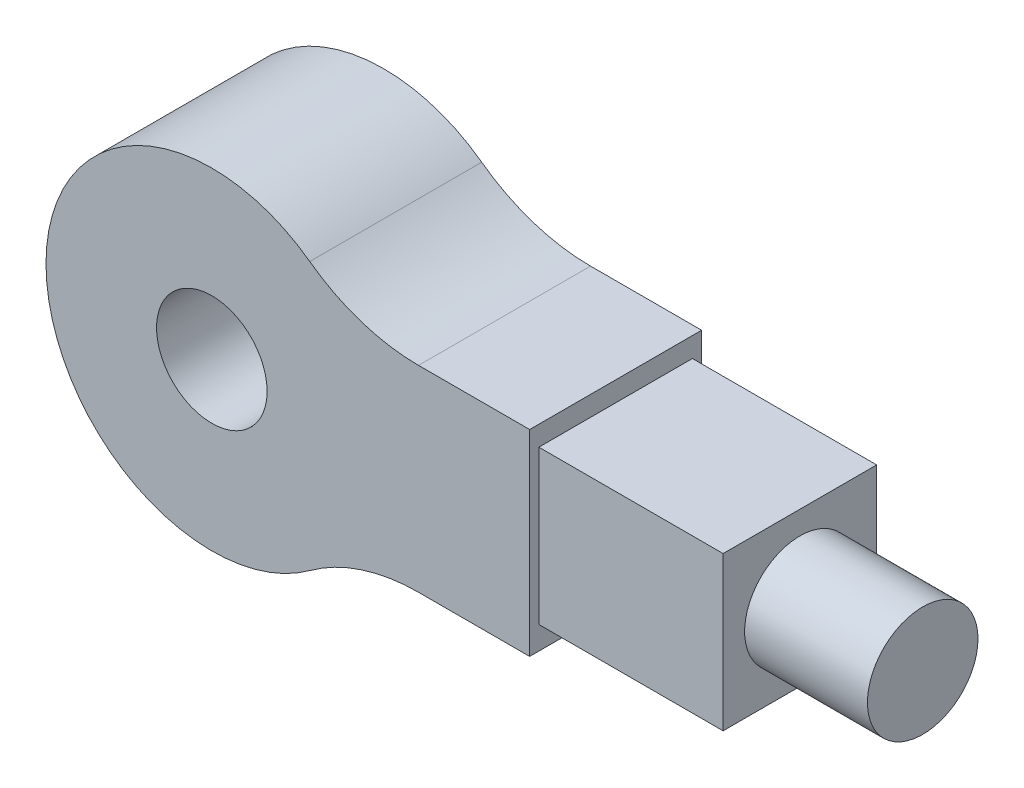
ISO-10303-21;
HEADER;
FILE_DESCRIPTION(('STEP AP214'),'2;1');
FILE_NAME('part.step','',(''),(''),'','','');
FILE_SCHEMA(('AUTOMOTIVE_DESIGN { 1 0 10303 214 1 1 1 1 }'));
ENDSEC;
DATA;
#1=APPLICATION_CONTEXT('core data for automotive mechanical design processes');
#2=APPLICATION_PROTOCOL_DEFINITION('international standard','automotive_design',2000,#1);
#3=PRODUCT_CONTEXT('',#1,'mechanical');
#4=PRODUCT('Part','Part','',(#3));
#5=PRODUCT_RELATED_PRODUCT_CATEGORY('part','',(#4));
#6=PRODUCT_DEFINITION_FORMATION('','',#4);
#7=PRODUCT_DEFINITION_CONTEXT('part definition',#1,'design');
#8=PRODUCT_DEFINITION('design','',#6,#7);
#9=PRODUCT_DEFINITION_SHAPE('','',#8);
#10=(LENGTH_UNIT() NAMED_UNIT(*) SI_UNIT(.MILLI.,.METRE.));
#11=(NAMED_UNIT(*) PLANE_ANGLE_UNIT() SI_UNIT($,.RADIAN.));
#12=(NAMED_UNIT(*) SI_UNIT($,.STERADIAN.) SOLID_ANGLE_UNIT());
#13=UNCERTAINTY_MEASURE_WITH_UNIT(LENGTH_MEASURE(1.E-05),#10,'distance_accuracy_value','');
#14=(GEOMETRIC_REPRESENTATION_CONTEXT(3) GLOBAL_UNCERTAINTY_ASSIGNED_CONTEXT((#13)) GLOBAL_UNIT_ASSIGNED_CONTEXT((#10,
#11,#12)) REPRESENTATION_CONTEXT('',''));
#15=CARTESIAN_POINT('',(0.,0.,0.));
#16=DIRECTION('',(0.,0.,1.));
#17=DIRECTION('',(1.,0.,0.));
#18=AXIS2_PLACEMENT_3D('',#15,#16,#17);
#19=CARTESIAN_POINT('',(81.7485631709315,0.,14.));
#20=DIRECTION('',(1.,0.,0.));
#21=DIRECTION('',(0.,0.,-1.));
#22=AXIS2_PLACEMENT_3D('',#19,#20,#21);
#23=PLANE('',#22);
#24=CARTESIAN_POINT('',(81.7485631709315,0.,14.));
#25=DIRECTION('',(1.,0.,0.));
#26=DIRECTION('',(0.,0.,-1.));
#27=AXIS2_PLACEMENT_3D('',#24,#25,#26);
#28=CIRCLE('',#27,9.);
#29=CARTESIAN_POINT('',(81.7485631709315,0.,5.));
#30=VERTEX_POINT('',#29);
#31=EDGE_CURVE('E191',#30,#30,#28,.T.);
#32=ORIENTED_EDGE('',*,*,#31,.F.);
#33=EDGE_LOOP('',(#32));
#34=FACE_BOUND('',#33,.T.);
#35=DIRECTION('',(0.,0.,1.));
#36=VECTOR('',#35,1.);
#37=CARTESIAN_POINT('',(81.7485631709315,12.7599814091509,26.5));
#38=LINE('',#37,#36);
#39=CARTESIAN_POINT('',(81.7485631709315,12.7599814091509,1.5));
#40=VERTEX_POINT('',#39);
#41=CARTESIAN_POINT('',(81.7485631709315,12.7599814091509,26.5));
#42=VERTEX_POINT('',#41);
#43=EDGE_CURVE('E157',#40,#42,#38,.T.);
#44=ORIENTED_EDGE('',*,*,#43,.T.);
#45=DIRECTION('',(0.,-1.,0.));
#46=VECTOR('',#45,1.);
#47=CARTESIAN_POINT('',(81.7485631709315,12.7599814091509,26.5));
#48=LINE('',#47,#46);
#49=CARTESIAN_POINT('',(81.7485631709315,-12.2400185908491,26.5));
#50=VERTEX_POINT('',#49);
#51=EDGE_CURVE('E167',#42,#50,#48,.T.);
#52=ORIENTED_EDGE('',*,*,#51,.T.);
#53=DIRECTION('',(0.,0.,-1.));
#54=VECTOR('',#53,1.);
#55=CARTESIAN_POINT('',(81.7485631709315,-12.2400185908491,26.5));
#56=LINE('',#55,#54);
#57=CARTESIAN_POINT('',(81.7485631709315,-12.2400185908491,1.5));
#58=VERTEX_POINT('',#57);
#59=EDGE_CURVE('E135',#50,#58,#56,.T.);
#60=ORIENTED_EDGE('',*,*,#59,.T.);
#61=DIRECTION('',(0.,1.,0.));
#62=VECTOR('',#61,1.);
#63=CARTESIAN_POINT('',(81.7485631709315,12.7599814091509,1.5));
#64=LINE('',#63,#62);
#65=EDGE_CURVE('E75',#58,#40,#64,.T.);
#66=ORIENTED_EDGE('',*,*,#65,.T.);
#67=EDGE_LOOP('',(#44,#52,#60,#66));
#68=FACE_BOUND('',#67,.T.);
#69=ADVANCED_FACE('F52',(#34,#68),#23,.T.);
#70=CARTESIAN_POINT('',(81.7485631709315,0.,14.));
#71=DIRECTION('',(1.,0.,0.));
#72=DIRECTION('',(0.,0.,-1.));
#73=AXIS2_PLACEMENT_3D('',#70,#71,#72);
#74=CYLINDRICAL_SURFACE('',#73,9.);
#75=ORIENTED_EDGE('',*,*,#31,.T.);
#76=EDGE_LOOP('',(#75));
#77=FACE_BOUND('',#76,.T.);
#78=CARTESIAN_POINT('',(101.748563170932,0.,14.));
#79=DIRECTION('',(1.,0.,0.));
#80=DIRECTION('',(0.,0.,-1.));
#81=AXIS2_PLACEMENT_3D('',#78,#79,#80);
#82=CIRCLE('',#81,9.);
#83=CARTESIAN_POINT('',(101.748563170932,0.,5.));
#84=VERTEX_POINT('',#83);
#85=EDGE_CURVE('E190',#84,#84,#82,.T.);
#86=ORIENTED_EDGE('',*,*,#85,.F.);
#87=EDGE_LOOP('',(#86));
#88=FACE_BOUND('',#87,.T.);
#89=ADVANCED_FACE('F286',(#77,#88),#74,.T.);
#90=CARTESIAN_POINT('',(101.748563170932,16.,28.));
#91=DIRECTION('',(-1.,0.,0.));
#92=DIRECTION('',(0.,0.,1.));
#93=AXIS2_PLACEMENT_3D('',#90,#91,#92);
#94=PLANE('',#93);
#95=ORIENTED_EDGE('',*,*,#85,.T.);
#96=EDGE_LOOP('',(#95));
#97=FACE_BOUND('',#96,.T.);
#98=ADVANCED_FACE('F278',(#97),#94,.F.);
#99=CARTESIAN_POINT('',(51.7485631709315,0.,14.));
#100=DIRECTION('',(1.,0.,0.));
#101=DIRECTION('',(0.,0.,-1.));
#102=AXIS2_PLACEMENT_3D('',#99,#100,#101);
#103=PLANE('',#102);
#104=DIRECTION('',(0.,0.,1.));
#105=VECTOR('',#104,1.);
#106=CARTESIAN_POINT('',(51.7485631709315,12.7599814091509,26.5));
#107=LINE('',#106,#105);
#108=CARTESIAN_POINT('',(51.7485631709315,12.7599814091509,1.5));
#109=VERTEX_POINT('',#108);
#110=CARTESIAN_POINT('',(51.7485631709315,12.7599814091509,26.5));
#111=VERTEX_POINT('',#110);
#112=EDGE_CURVE('E142',#109,#111,#107,.T.);
#113=ORIENTED_EDGE('',*,*,#112,.F.);
#114=DIRECTION('',(0.,1.,0.));
#115=VECTOR('',#114,1.);
#116=CARTESIAN_POINT('',(51.7485631709315,12.7599814091509,1.5));
#117=LINE('',#116,#115);
#118=CARTESIAN_POINT('',(51.7485631709315,-12.2400185908491,1.5));
#119=VERTEX_POINT('',#118);
#120=EDGE_CURVE('E151',#119,#109,#117,.T.);
#121=ORIENTED_EDGE('',*,*,#120,.F.);
#122=DIRECTION('',(0.,0.,-1.));
#123=VECTOR('',#122,1.);
#124=CARTESIAN_POINT('',(51.7485631709315,-12.2400185908491,26.5));
#125=LINE('',#124,#123);
#126=CARTESIAN_POINT('',(51.7485631709315,-12.2400185908491,26.5));
#127=VERTEX_POINT('',#126);
#128=EDGE_CURVE('E133',#127,#119,#125,.T.);
#129=ORIENTED_EDGE('',*,*,#128,.F.);
#130=DIRECTION('',(0.,-1.,0.));
#131=VECTOR('',#130,1.);
#132=CARTESIAN_POINT('',(51.7485631709315,12.7599814091509,26.5));
#133=LINE('',#132,#131);
#134=EDGE_CURVE('E148',#111,#127,#133,.T.);
#135=ORIENTED_EDGE('',*,*,#134,.F.);
#136=EDGE_LOOP('',(#113,#121,#129,#135));
#137=FACE_BOUND('',#136,.T.);
#138=DIRECTION('',(0.,0.,-1.));
#139=VECTOR('',#138,1.);
#140=CARTESIAN_POINT('',(51.7485631709315,-16.,28.));
#141=LINE('',#140,#139);
#142=CARTESIAN_POINT('',(51.7485631709315,-16.,28.));
#143=VERTEX_POINT('',#142);
#144=CARTESIAN_POINT('',(51.7485631709315,-16.,0.));
#145=VERTEX_POINT('',#144);
#146=EDGE_CURVE('E187',#143,#145,#141,.T.);
#147=ORIENTED_EDGE('',*,*,#146,.T.);
#148=DIRECTION('',(0.,1.,0.));
#149=VECTOR('',#148,1.);
#150=CARTESIAN_POINT('',(51.7485631709315,-46.,0.));
#151=LINE('',#150,#149);
#152=CARTESIAN_POINT('',(51.7485631709315,16.,0.));
#153=VERTEX_POINT('',#152);
#154=EDGE_CURVE('E67',#145,#153,#151,.T.);
#155=ORIENTED_EDGE('',*,*,#154,.T.);
#156=DIRECTION('',(0.,0.,1.));
#157=VECTOR('',#156,1.);
#158=CARTESIAN_POINT('',(51.7485631709315,16.,28.));
#159=LINE('',#158,#157);
#160=CARTESIAN_POINT('',(51.7485631709315,16.,28.));
#161=VERTEX_POINT('',#160);
#162=EDGE_CURVE('E13',#153,#161,#159,.T.);
#163=ORIENTED_EDGE('',*,*,#162,.T.);
#164=DIRECTION('',(0.,1.,0.));
#165=VECTOR('',#164,1.);
#166=CARTESIAN_POINT('',(51.7485631709315,-46.,28.));
#167=LINE('',#166,#165);
#168=EDGE_CURVE('E183',#143,#161,#167,.T.);
#169=ORIENTED_EDGE('',*,*,#168,.F.);
#170=EDGE_LOOP('',(#147,#155,#163,#169));
#171=FACE_BOUND('',#170,.T.);
#172=ADVANCED_FACE('F147',(#137,#171),#103,.T.);
#173=CARTESIAN_POINT('',(51.7485631709315,12.7599814091509,26.5));
#174=DIRECTION('',(0.,0.,1.));
#175=DIRECTION('',(0.,-1.,0.));
#176=AXIS2_PLACEMENT_3D('',#173,#174,#175);
#177=PLANE('',#176);
#178=ORIENTED_EDGE('',*,*,#51,.F.);
#179=DIRECTION('',(1.,0.,0.));
#180=VECTOR('',#179,1.);
#181=CARTESIAN_POINT('',(51.7485631709315,12.7599814091509,26.5));
#182=LINE('',#181,#180);
#183=EDGE_CURVE('E155',#111,#42,#182,.T.);
#184=ORIENTED_EDGE('',*,*,#183,.F.);
#185=ORIENTED_EDGE('',*,*,#134,.T.);
#186=DIRECTION('',(1.,0.,0.));
#187=VECTOR('',#186,1.);
#188=CARTESIAN_POINT('',(51.7485631709315,-12.2400185908491,26.5));
#189=LINE('',#188,#187);
#190=EDGE_CURVE('E130',#127,#50,#189,.T.);
#191=ORIENTED_EDGE('',*,*,#190,.T.);
#192=EDGE_LOOP('',(#178,#184,#185,#191));
#193=FACE_BOUND('',#192,.T.);
#194=ADVANCED_FACE('F154',(#193),#177,.T.);
#195=CARTESIAN_POINT('',(51.7485631709315,12.7599814091509,26.5));
#196=DIRECTION('',(0.,1.,0.));
#197=DIRECTION('',(0.,0.,1.));
#198=AXIS2_PLACEMENT_3D('',#195,#196,#197);
#199=PLANE('',#198);
#200=ORIENTED_EDGE('',*,*,#43,.F.);
#201=DIRECTION('',(1.,0.,0.));
#202=VECTOR('',#201,1.);
#203=CARTESIAN_POINT('',(51.7485631709315,12.7599814091509,1.5));
#204=LINE('',#203,#202);
#205=EDGE_CURVE('E176',#109,#40,#204,.T.);
#206=ORIENTED_EDGE('',*,*,#205,.F.);
#207=ORIENTED_EDGE('',*,*,#112,.T.);
#208=ORIENTED_EDGE('',*,*,#183,.T.);
#209=EDGE_LOOP('',(#200,#206,#207,#208));
#210=FACE_BOUND('',#209,.T.);
#211=ADVANCED_FACE('F284',(#210),#199,.T.);
#212=CARTESIAN_POINT('',(51.7485631709315,12.7599814091509,1.5));
#213=DIRECTION('',(0.,0.,-1.));
#214=DIRECTION('',(0.,1.,0.));
#215=AXIS2_PLACEMENT_3D('',#212,#213,#214);
#216=PLANE('',#215);
#217=ORIENTED_EDGE('',*,*,#65,.F.);
#218=DIRECTION('',(1.,0.,0.));
#219=VECTOR('',#218,1.);
#220=CARTESIAN_POINT('',(51.7485631709315,-12.2400185908491,1.5));
#221=LINE('',#220,#219);
#222=EDGE_CURVE('E141',#119,#58,#221,.T.);
#223=ORIENTED_EDGE('',*,*,#222,.F.);
#224=ORIENTED_EDGE('',*,*,#120,.T.);
#225=ORIENTED_EDGE('',*,*,#205,.T.);
#226=EDGE_LOOP('',(#217,#223,#224,#225));
#227=FACE_BOUND('',#226,.T.);
#228=ADVANCED_FACE('F409',(#227),#216,.T.);
#229=CARTESIAN_POINT('',(51.7485631709315,-12.2400185908491,26.5));
#230=DIRECTION('',(0.,-1.,0.));
#231=DIRECTION('',(0.,0.,-1.));
#232=AXIS2_PLACEMENT_3D('',#229,#230,#231);
#233=PLANE('',#232);
#234=ORIENTED_EDGE('',*,*,#59,.F.);
#235=ORIENTED_EDGE('',*,*,#190,.F.);
#236=ORIENTED_EDGE('',*,*,#128,.T.);
#237=ORIENTED_EDGE('',*,*,#222,.T.);
#238=EDGE_LOOP('',(#234,#235,#236,#237));
#239=FACE_BOUND('',#238,.T.);
#240=ADVANCED_FACE('F132',(#239),#233,.T.);
#241=CARTESIAN_POINT('',(0.,0.,28.));
#242=DIRECTION('',(0.,0.,-1.));
#243=DIRECTION('',(-1.,0.,0.));
#244=AXIS2_PLACEMENT_3D('',#241,#242,#243);
#245=CYLINDRICAL_SURFACE('',#244,27.);
#246=CARTESIAN_POINT('',(0.,0.,0.));
#247=DIRECTION('',(0.,0.,1.));
#248=DIRECTION('',(1.,0.,0.));
#249=AXIS2_PLACEMENT_3D('',#246,#247,#248);
#250=CIRCLE('',#249,27.);
#251=CARTESIAN_POINT('',(15.9442414860381,21.7894736842105,0.));
#252=VERTEX_POINT('',#251);
#253=CARTESIAN_POINT('',(15.944241486038,-21.7894736842105,0.));
#254=VERTEX_POINT('',#253);
#255=EDGE_CURVE('E212',#252,#254,#250,.T.);
#256=ORIENTED_EDGE('',*,*,#255,.T.);
#257=DIRECTION('',(0.,0.,-1.));
#258=VECTOR('',#257,1.);
#259=CARTESIAN_POINT('',(15.944241486038,-21.7894736842105,28.));
#260=LINE('',#259,#258);
#261=CARTESIAN_POINT('',(15.944241486038,-21.7894736842105,28.));
#262=VERTEX_POINT('',#261);
#263=EDGE_CURVE('E225',#262,#254,#260,.T.);
#264=ORIENTED_EDGE('',*,*,#263,.F.);
#265=CARTESIAN_POINT('',(0.,0.,28.));
#266=DIRECTION('',(0.,0.,1.));
#267=DIRECTION('',(1.,0.,0.));
#268=AXIS2_PLACEMENT_3D('',#265,#266,#267);
#269=CIRCLE('',#268,27.);
#270=CARTESIAN_POINT('',(15.9442414860381,21.7894736842105,28.));
#271=VERTEX_POINT('',#270);
#272=EDGE_CURVE('E222',#271,#262,#269,.T.);
#273=ORIENTED_EDGE('',*,*,#272,.F.);
#274=DIRECTION('',(0.,0.,-1.));
#275=VECTOR('',#274,1.);
#276=CARTESIAN_POINT('',(15.9442414860381,21.7894736842105,28.));
#277=LINE('',#276,#275);
#278=EDGE_CURVE('E244',#271,#252,#277,.T.);
#279=ORIENTED_EDGE('',*,*,#278,.T.);
#280=EDGE_LOOP('',(#256,#264,#273,#279));
#281=FACE_BOUND('',#280,.T.);
#282=ADVANCED_FACE('F303',(#281),#245,.T.);
#283=CARTESIAN_POINT('',(0.,0.,28.));
#284=DIRECTION('',(0.,0.,-1.));
#285=DIRECTION('',(-1.,0.,0.));
#286=AXIS2_PLACEMENT_3D('',#283,#284,#285);
#287=CYLINDRICAL_SURFACE('',#286,9.);
#288=CARTESIAN_POINT('',(0.,0.,28.));
#289=DIRECTION('',(0.,0.,1.));
#290=DIRECTION('',(1.,0.,0.));
#291=AXIS2_PLACEMENT_3D('',#288,#289,#290);
#292=CIRCLE('',#291,9.);
#293=CARTESIAN_POINT('',(9.,0.,28.));
#294=VERTEX_POINT('',#293);
#295=EDGE_CURVE('E199',#294,#294,#292,.T.);
#296=ORIENTED_EDGE('',*,*,#295,.T.);
#297=EDGE_LOOP('',(#296));
#298=FACE_BOUND('',#297,.T.);
#299=CARTESIAN_POINT('',(0.,0.,0.));
#300=DIRECTION('',(0.,0.,1.));
#301=DIRECTION('',(1.,0.,0.));
#302=AXIS2_PLACEMENT_3D('',#299,#300,#301);
#303=CIRCLE('',#302,9.);
#304=CARTESIAN_POINT('',(9.,0.,0.));
#305=VERTEX_POINT('',#304);
#306=EDGE_CURVE('E195',#305,#305,#303,.T.);
#307=ORIENTED_EDGE('',*,*,#306,.F.);
#308=EDGE_LOOP('',(#307));
#309=FACE_BOUND('',#308,.T.);
#310=ADVANCED_FACE('F300',(#298,#309),#287,.F.);
#311=CARTESIAN_POINT('',(33.6600653594137,-46.,28.));
#312=DIRECTION('',(0.,0.,-1.));
#313=DIRECTION('',(-1.,0.,0.));
#314=AXIS2_PLACEMENT_3D('',#311,#312,#313);
#315=CYLINDRICAL_SURFACE('',#314,30.);
#316=CARTESIAN_POINT('',(33.6600653594137,-46.,0.));
#317=DIRECTION('',(0.,0.,-1.));
#318=DIRECTION('',(1.,0.,0.));
#319=AXIS2_PLACEMENT_3D('',#316,#317,#318);
#320=CIRCLE('',#319,30.);
#321=CARTESIAN_POINT('',(33.6600653594137,-16.,0.));
#322=VERTEX_POINT('',#321);
#323=EDGE_CURVE('E203',#254,#322,#320,.T.);
#324=ORIENTED_EDGE('',*,*,#323,.T.);
#325=DIRECTION('',(0.,0.,-1.));
#326=VECTOR('',#325,1.);
#327=CARTESIAN_POINT('',(33.6600653594137,-16.,28.));
#328=LINE('',#327,#326);
#329=CARTESIAN_POINT('',(33.6600653594137,-16.,28.));
#330=VERTEX_POINT('',#329);
#331=EDGE_CURVE('E61',#330,#322,#328,.T.);
#332=ORIENTED_EDGE('',*,*,#331,.F.);
#333=CARTESIAN_POINT('',(33.6600653594137,-46.,28.));
#334=DIRECTION('',(0.,0.,-1.));
#335=DIRECTION('',(1.,0.,0.));
#336=AXIS2_PLACEMENT_3D('',#333,#334,#335);
#337=CIRCLE('',#336,30.);
#338=EDGE_CURVE('E207',#262,#330,#337,.T.);
#339=ORIENTED_EDGE('',*,*,#338,.F.);
#340=ORIENTED_EDGE('',*,*,#263,.T.);
#341=EDGE_LOOP('',(#324,#332,#339,#340));
#342=FACE_BOUND('',#341,.T.);
#343=ADVANCED_FACE('F54',(#342),#315,.F.);
#344=CARTESIAN_POINT('',(33.6600653594137,46.,28.));
#345=DIRECTION('',(0.,0.,-1.));
#346=DIRECTION('',(-1.,0.,0.));
#347=AXIS2_PLACEMENT_3D('',#344,#345,#346);
#348=CYLINDRICAL_SURFACE('',#347,30.);
#349=CARTESIAN_POINT('',(33.6600653594137,46.,0.));
#350=DIRECTION('',(0.,0.,-1.));
#351=DIRECTION('',(-1.,0.,0.));
#352=AXIS2_PLACEMENT_3D('',#349,#350,#351);
#353=CIRCLE('',#352,30.);
#354=CARTESIAN_POINT('',(33.6600653594137,16.,0.));
#355=VERTEX_POINT('',#354);
#356=EDGE_CURVE('E236',#355,#252,#353,.T.);
#357=ORIENTED_EDGE('',*,*,#356,.T.);
#358=ORIENTED_EDGE('',*,*,#278,.F.);
#359=CARTESIAN_POINT('',(33.6600653594137,46.,28.));
#360=DIRECTION('',(0.,0.,-1.));
#361=DIRECTION('',(-1.,0.,0.));
#362=AXIS2_PLACEMENT_3D('',#359,#360,#361);
#363=CIRCLE('',#362,30.);
#364=CARTESIAN_POINT('',(33.6600653594137,16.,28.));
#365=VERTEX_POINT('',#364);
#366=EDGE_CURVE('E219',#365,#271,#363,.T.);
#367=ORIENTED_EDGE('',*,*,#366,.F.);
#368=DIRECTION('',(0.,0.,-1.));
#369=VECTOR('',#368,1.);
#370=CARTESIAN_POINT('',(33.6600653594137,16.,28.));
#371=LINE('',#370,#369);
#372=EDGE_CURVE('E248',#365,#355,#371,.T.);
#373=ORIENTED_EDGE('',*,*,#372,.T.);
#374=EDGE_LOOP('',(#357,#358,#367,#373));
#375=FACE_BOUND('',#374,.T.);
#376=ADVANCED_FACE('F272',(#375),#348,.F.);
#377=CARTESIAN_POINT('',(33.6600653594137,16.,28.));
#378=DIRECTION('',(0.,-1.,0.));
#379=DIRECTION('',(0.,0.,-1.));
#380=AXIS2_PLACEMENT_3D('',#377,#378,#379);
#381=PLANE('',#380);
#382=ORIENTED_EDGE('',*,*,#162,.F.);
#383=DIRECTION('',(-1.,0.,0.));
#384=VECTOR('',#383,1.);
#385=CARTESIAN_POINT('',(33.6600653594137,16.,0.));
#386=LINE('',#385,#384);
#387=EDGE_CURVE('E233',#153,#355,#386,.T.);
#388=ORIENTED_EDGE('',*,*,#387,.T.);
#389=ORIENTED_EDGE('',*,*,#372,.F.);
#390=DIRECTION('',(-1.,0.,0.));
#391=VECTOR('',#390,1.);
#392=CARTESIAN_POINT('',(33.6600653594137,16.,28.));
#393=LINE('',#392,#391);
#394=EDGE_CURVE('E216',#161,#365,#393,.T.);
#395=ORIENTED_EDGE('',*,*,#394,.F.);
#396=EDGE_LOOP('',(#382,#388,#389,#395));
#397=FACE_BOUND('',#396,.T.);
#398=ADVANCED_FACE('F268',(#397),#381,.F.);
#399=CARTESIAN_POINT('',(33.6600653594137,-16.,28.));
#400=DIRECTION('',(0.,1.,0.));
#401=DIRECTION('',(0.,0.,1.));
#402=AXIS2_PLACEMENT_3D('',#399,#400,#401);
#403=PLANE('',#402);
#404=ORIENTED_EDGE('',*,*,#146,.F.);
#405=DIRECTION('',(1.,0.,0.));
#406=VECTOR('',#405,1.);
#407=CARTESIAN_POINT('',(33.6600653594137,-16.,28.));
#408=LINE('',#407,#406);
#409=EDGE_CURVE('E211',#330,#143,#408,.T.);
#410=ORIENTED_EDGE('',*,*,#409,.F.);
#411=ORIENTED_EDGE('',*,*,#331,.T.);
#412=DIRECTION('',(1.,0.,0.));
#413=VECTOR('',#412,1.);
#414=CARTESIAN_POINT('',(33.6600653594137,-16.,0.));
#415=LINE('',#414,#413);
#416=EDGE_CURVE('E229',#322,#145,#415,.T.);
#417=ORIENTED_EDGE('',*,*,#416,.T.);
#418=EDGE_LOOP('',(#404,#410,#411,#417));
#419=FACE_BOUND('',#418,.T.);
#420=ADVANCED_FACE('F256',(#419),#403,.F.);
#421=CARTESIAN_POINT('',(33.6600653594137,-46.,0.));
#422=DIRECTION('',(0.,0.,1.));
#423=DIRECTION('',(1.,0.,0.));
#424=AXIS2_PLACEMENT_3D('',#421,#422,#423);
#425=PLANE('',#424);
#426=ORIENTED_EDGE('',*,*,#306,.T.);
#427=EDGE_LOOP('',(#426));
#428=FACE_BOUND('',#427,.T.);
#429=ORIENTED_EDGE('',*,*,#154,.F.);
#430=ORIENTED_EDGE('',*,*,#416,.F.);
#431=ORIENTED_EDGE('',*,*,#323,.F.);
#432=ORIENTED_EDGE('',*,*,#255,.F.);
#433=ORIENTED_EDGE('',*,*,#356,.F.);
#434=ORIENTED_EDGE('',*,*,#387,.F.);
#435=EDGE_LOOP('',(#429,#430,#431,#432,#433,#434));
#436=FACE_BOUND('',#435,.T.);
#437=ADVANCED_FACE('F263',(#428,#436),#425,.F.);
#438=CARTESIAN_POINT('',(33.6600653594137,-46.,28.));
#439=DIRECTION('',(0.,0.,1.));
#440=DIRECTION('',(1.,0.,0.));
#441=AXIS2_PLACEMENT_3D('',#438,#439,#440);
#442=PLANE('',#441);
#443=ORIENTED_EDGE('',*,*,#295,.F.);
#444=EDGE_LOOP('',(#443));
#445=FACE_BOUND('',#444,.T.);
#446=ORIENTED_EDGE('',*,*,#409,.T.);
#447=ORIENTED_EDGE('',*,*,#168,.T.);
#448=ORIENTED_EDGE('',*,*,#394,.T.);
#449=ORIENTED_EDGE('',*,*,#366,.T.);
#450=ORIENTED_EDGE('',*,*,#272,.T.);
#451=ORIENTED_EDGE('',*,*,#338,.T.);
#452=EDGE_LOOP('',(#446,#447,#448,#449,#450,#451));
#453=FACE_BOUND('',#452,.T.);
#454=ADVANCED_FACE('F276',(#445,#453),#442,.T.);
#455=CLOSED_SHELL('',(#69,#89,#98,#172,#194,#211,#228,#240,#282,#310,#343,#376,#398,#420,#437,#454));
#456=MANIFOLD_SOLID_BREP('B2',#455);
#457=ADVANCED_BREP_SHAPE_REPRESENTATION('',(#18,#456),#14);
#458=SHAPE_DEFINITION_REPRESENTATION(#9,#457);
ENDSEC;
END-ISO-10303-21;
